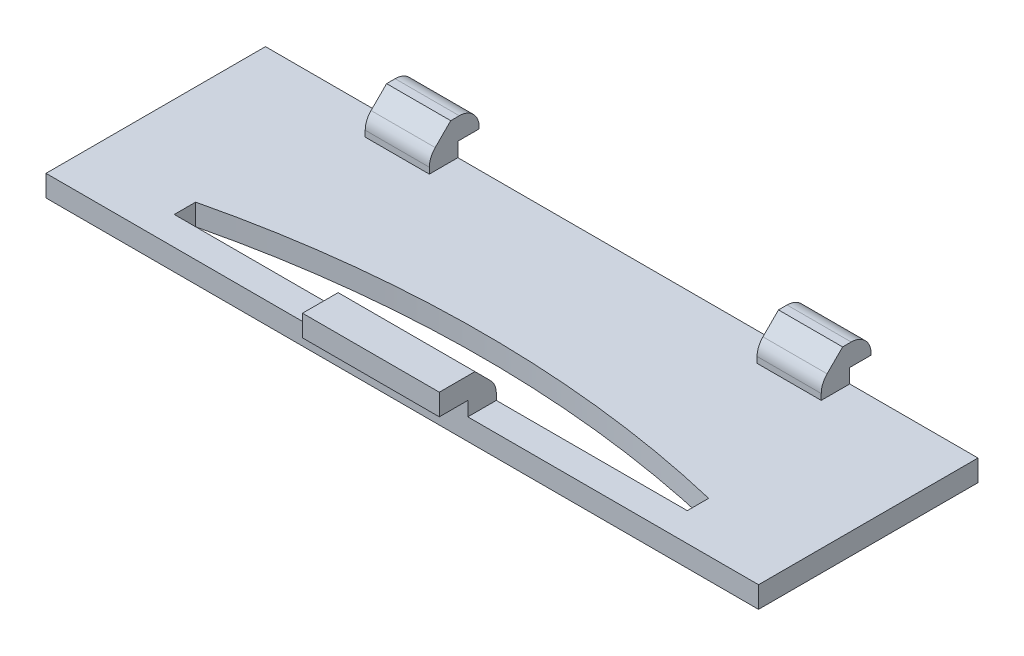
ISO-10303-21;
HEADER;
FILE_DESCRIPTION(('STEP AP214'),'2;1');
FILE_NAME('part.step','',(''),(''),'','','');
FILE_SCHEMA(('AUTOMOTIVE_DESIGN { 1 0 10303 214 1 1 1 1 }'));
ENDSEC;
DATA;
#1=APPLICATION_CONTEXT('core data for automotive mechanical design processes');
#2=APPLICATION_PROTOCOL_DEFINITION('international standard','automotive_design',2000,#1);
#3=PRODUCT_CONTEXT('',#1,'mechanical');
#4=PRODUCT('Part','Part','',(#3));
#5=PRODUCT_RELATED_PRODUCT_CATEGORY('part','',(#4));
#6=PRODUCT_DEFINITION_FORMATION('','',#4);
#7=PRODUCT_DEFINITION_CONTEXT('part definition',#1,'design');
#8=PRODUCT_DEFINITION('design','',#6,#7);
#9=PRODUCT_DEFINITION_SHAPE('','',#8);
#10=(LENGTH_UNIT() NAMED_UNIT(*) SI_UNIT(.MILLI.,.METRE.));
#11=(NAMED_UNIT(*) PLANE_ANGLE_UNIT() SI_UNIT($,.RADIAN.));
#12=(NAMED_UNIT(*) SI_UNIT($,.STERADIAN.) SOLID_ANGLE_UNIT());
#13=UNCERTAINTY_MEASURE_WITH_UNIT(LENGTH_MEASURE(1.E-05),#10,'distance_accuracy_value','');
#14=(GEOMETRIC_REPRESENTATION_CONTEXT(3) GLOBAL_UNCERTAINTY_ASSIGNED_CONTEXT((#13)) GLOBAL_UNIT_ASSIGNED_CONTEXT((#10,
#11,#12)) REPRESENTATION_CONTEXT('',''));
#15=CARTESIAN_POINT('',(0.,0.,0.));
#16=DIRECTION('',(0.,0.,1.));
#17=DIRECTION('',(1.,0.,0.));
#18=AXIS2_PLACEMENT_3D('',#15,#16,#17);
#19=CARTESIAN_POINT('',(0.,1.5,0.));
#20=DIRECTION('',(0.,1.,0.));
#21=DIRECTION('',(0.,0.,1.));
#22=AXIS2_PLACEMENT_3D('',#19,#20,#21);
#23=PLANE('',#22);
#24=DIRECTION('',(0.,0.,1.));
#25=VECTOR('',#24,1.);
#26=CARTESIAN_POINT('',(-79.2873563218391,1.5,-0.844827586206872));
#27=LINE('',#26,#25);
#28=CARTESIAN_POINT('',(-79.2873563218391,1.5,-0.844827586206872));
#29=VERTEX_POINT('',#28);
#30=CARTESIAN_POINT('',(-79.2873563218391,1.5,0.655172413793106));
#31=VERTEX_POINT('',#30);
#32=EDGE_CURVE('E296',#29,#31,#27,.T.);
#33=ORIENTED_EDGE('',*,*,#32,.F.);
#34=CARTESIAN_POINT('',(-61.287356321839,1.5,74.3895139735997));
#35=DIRECTION('',(0.,1.,0.));
#36=DIRECTION('',(0.,0.,1.));
#37=AXIS2_PLACEMENT_3D('',#34,#35,#36);
#38=CIRCLE('',#37,77.3576508817172);
#39=CARTESIAN_POINT('',(-43.2873563218391,1.5,-0.844827586206894));
#40=VERTEX_POINT('',#39);
#41=EDGE_CURVE('E267',#29,#40,#38,.F.);
#42=ORIENTED_EDGE('',*,*,#41,.T.);
#43=DIRECTION('',(0.,0.,-1.));
#44=VECTOR('',#43,1.);
#45=CARTESIAN_POINT('',(-43.2873563218391,1.5,-0.844827586206894));
#46=LINE('',#45,#44);
#47=CARTESIAN_POINT('',(-43.2873563218391,1.5,0.655172413793106));
#48=VERTEX_POINT('',#47);
#49=EDGE_CURVE('E272',#48,#40,#46,.T.);
#50=ORIENTED_EDGE('',*,*,#49,.F.);
#51=DIRECTION('',(1.,0.,0.));
#52=VECTOR('',#51,1.);
#53=CARTESIAN_POINT('',(-79.2873563218391,1.5,0.655172413793106));
#54=LINE('',#53,#52);
#55=CARTESIAN_POINT('',(-56.6873563218391,1.5,0.655172413793106));
#56=VERTEX_POINT('',#55);
#57=EDGE_CURVE('E509',#56,#48,#54,.T.);
#58=ORIENTED_EDGE('',*,*,#57,.F.);
#59=DIRECTION('',(0.,0.,-1.));
#60=VECTOR('',#59,1.);
#61=CARTESIAN_POINT('',(-56.6873563218391,1.5,0.655172413793106));
#62=LINE('',#61,#60);
#63=CARTESIAN_POINT('',(-56.6873563218391,1.5,2.65517241379311));
#64=VERTEX_POINT('',#63);
#65=EDGE_CURVE('E497',#64,#56,#62,.T.);
#66=ORIENTED_EDGE('',*,*,#65,.F.);
#67=DIRECTION('',(1.,0.,0.));
#68=VECTOR('',#67,1.);
#69=CARTESIAN_POINT('',(-36.2873563218391,1.5,2.6551724137931));
#70=LINE('',#69,#68);
#71=CARTESIAN_POINT('',(-36.2873563218391,1.5,2.6551724137931));
#72=VERTEX_POINT('',#71);
#73=EDGE_CURVE('E314',#64,#72,#70,.T.);
#74=ORIENTED_EDGE('',*,*,#73,.T.);
#75=DIRECTION('',(0.,0.,-1.));
#76=VECTOR('',#75,1.);
#77=CARTESIAN_POINT('',(-36.2873563218391,1.5,2.6551724137931));
#78=LINE('',#77,#76);
#79=CARTESIAN_POINT('',(-36.2873563218391,1.5,-12.7448275862069));
#80=VERTEX_POINT('',#79);
#81=EDGE_CURVE('E303',#72,#80,#78,.T.);
#82=ORIENTED_EDGE('',*,*,#81,.T.);
#83=DIRECTION('',(-1.,0.,0.));
#84=VECTOR('',#83,1.);
#85=CARTESIAN_POINT('',(-36.2873563218391,1.5,-12.7448275862069));
#86=LINE('',#85,#84);
#87=CARTESIAN_POINT('',(-45.2873563218391,1.5,-12.7448275862069));
#88=VERTEX_POINT('',#87);
#89=EDGE_CURVE('E308',#80,#88,#86,.T.);
#90=ORIENTED_EDGE('',*,*,#89,.T.);
#91=DIRECTION('',(0.,0.,-1.));
#92=VECTOR('',#91,1.);
#93=CARTESIAN_POINT('',(-45.2873563218391,1.5,-12.7448275862069));
#94=LINE('',#93,#92);
#95=CARTESIAN_POINT('',(-45.2873563218391,1.5,-10.7448275862069));
#96=VERTEX_POINT('',#95);
#97=EDGE_CURVE('E454',#96,#88,#94,.T.);
#98=ORIENTED_EDGE('',*,*,#97,.F.);
#99=DIRECTION('',(1.,0.,0.));
#100=VECTOR('',#99,1.);
#101=CARTESIAN_POINT('',(-49.7873563218391,1.5,-10.7448275862069));
#102=LINE('',#101,#100);
#103=CARTESIAN_POINT('',(-49.7873563218391,1.5,-10.7448275862069));
#104=VERTEX_POINT('',#103);
#105=EDGE_CURVE('E459',#104,#96,#102,.T.);
#106=ORIENTED_EDGE('',*,*,#105,.F.);
#107=DIRECTION('',(0.,0.,1.));
#108=VECTOR('',#107,1.);
#109=CARTESIAN_POINT('',(-49.7873563218391,1.5,-12.7448275862069));
#110=LINE('',#109,#108);
#111=CARTESIAN_POINT('',(-49.7873563218391,1.5,-12.7448275862069));
#112=VERTEX_POINT('',#111);
#113=EDGE_CURVE('E450',#112,#104,#110,.T.);
#114=ORIENTED_EDGE('',*,*,#113,.F.);
#115=CARTESIAN_POINT('',(-72.7873563218391,1.5,-12.7448275862069));
#116=VERTEX_POINT('',#115);
#117=EDGE_CURVE('E312',#112,#116,#86,.T.);
#118=ORIENTED_EDGE('',*,*,#117,.T.);
#119=DIRECTION('',(0.,0.,-1.));
#120=VECTOR('',#119,1.);
#121=CARTESIAN_POINT('',(-72.7873563218391,1.5,-12.7448275862069));
#122=LINE('',#121,#120);
#123=CARTESIAN_POINT('',(-72.7873563218391,1.5,-10.7448275862069));
#124=VERTEX_POINT('',#123);
#125=EDGE_CURVE('E475',#124,#116,#122,.T.);
#126=ORIENTED_EDGE('',*,*,#125,.F.);
#127=DIRECTION('',(1.,0.,0.));
#128=VECTOR('',#127,1.);
#129=CARTESIAN_POINT('',(-77.2873563218391,1.5,-10.7448275862069));
#130=LINE('',#129,#128);
#131=CARTESIAN_POINT('',(-77.2873563218391,1.5,-10.7448275862069));
#132=VERTEX_POINT('',#131);
#133=EDGE_CURVE('E481',#132,#124,#130,.T.);
#134=ORIENTED_EDGE('',*,*,#133,.F.);
#135=DIRECTION('',(0.,0.,1.));
#136=VECTOR('',#135,1.);
#137=CARTESIAN_POINT('',(-77.2873563218391,1.5,-12.7448275862069));
#138=LINE('',#137,#136);
#139=CARTESIAN_POINT('',(-77.2873563218391,1.5,-12.7448275862069));
#140=VERTEX_POINT('',#139);
#141=EDGE_CURVE('E471',#140,#132,#138,.T.);
#142=ORIENTED_EDGE('',*,*,#141,.F.);
#143=CARTESIAN_POINT('',(-86.2873563218391,1.5,-12.7448275862069));
#144=VERTEX_POINT('',#143);
#145=EDGE_CURVE('E306',#140,#144,#86,.T.);
#146=ORIENTED_EDGE('',*,*,#145,.T.);
#147=DIRECTION('',(0.,0.,1.));
#148=VECTOR('',#147,1.);
#149=CARTESIAN_POINT('',(-86.2873563218391,1.5,2.65517241379311));
#150=LINE('',#149,#148);
#151=CARTESIAN_POINT('',(-86.2873563218391,1.5,2.65517241379311));
#152=VERTEX_POINT('',#151);
#153=EDGE_CURVE('E311',#144,#152,#150,.T.);
#154=ORIENTED_EDGE('',*,*,#153,.T.);
#155=CARTESIAN_POINT('',(-66.2873563218391,1.5,2.65517241379311));
#156=VERTEX_POINT('',#155);
#157=EDGE_CURVE('E315',#152,#156,#70,.T.);
#158=ORIENTED_EDGE('',*,*,#157,.T.);
#159=DIRECTION('',(0.,0.,1.));
#160=VECTOR('',#159,1.);
#161=CARTESIAN_POINT('',(-66.2873563218391,1.5,0.655172413793106));
#162=LINE('',#161,#160);
#163=CARTESIAN_POINT('',(-66.2873563218391,1.5,0.655172413793106));
#164=VERTEX_POINT('',#163);
#165=EDGE_CURVE('E493',#164,#156,#162,.T.);
#166=ORIENTED_EDGE('',*,*,#165,.F.);
#167=EDGE_CURVE('E510',#31,#164,#54,.T.);
#168=ORIENTED_EDGE('',*,*,#167,.F.);
#169=EDGE_LOOP('',(#33,#42,#50,#58,#66,#74,#82,#90,#98,#106,#114,#118,#126,#134,#142,#146,#154,
#158,#166,#168));
#170=FACE_BOUND('',#169,.T.);
#171=ADVANCED_FACE('F42',(#170),#23,.T.);
#172=CARTESIAN_POINT('',(0.,0.,0.));
#173=DIRECTION('',(0.,1.,0.));
#174=DIRECTION('',(0.,0.,1.));
#175=AXIS2_PLACEMENT_3D('',#172,#173,#174);
#176=PLANE('',#175);
#177=DIRECTION('',(0.,0.,-1.));
#178=VECTOR('',#177,1.);
#179=CARTESIAN_POINT('',(-36.2873563218391,0.,2.6551724137931));
#180=LINE('',#179,#178);
#181=CARTESIAN_POINT('',(-36.2873563218391,0.,2.6551724137931));
#182=VERTEX_POINT('',#181);
#183=CARTESIAN_POINT('',(-36.2873563218391,0.,-12.7448275862069));
#184=VERTEX_POINT('',#183);
#185=EDGE_CURVE('E302',#182,#184,#180,.T.);
#186=ORIENTED_EDGE('',*,*,#185,.F.);
#187=DIRECTION('',(1.,0.,0.));
#188=VECTOR('',#187,1.);
#189=CARTESIAN_POINT('',(-36.2873563218391,0.,2.6551724137931));
#190=LINE('',#189,#188);
#191=CARTESIAN_POINT('',(-86.2873563218391,0.,2.65517241379311));
#192=VERTEX_POINT('',#191);
#193=EDGE_CURVE('E307',#192,#182,#190,.T.);
#194=ORIENTED_EDGE('',*,*,#193,.F.);
#195=DIRECTION('',(0.,0.,1.));
#196=VECTOR('',#195,1.);
#197=CARTESIAN_POINT('',(-86.2873563218391,0.,2.65517241379311));
#198=LINE('',#197,#196);
#199=CARTESIAN_POINT('',(-86.2873563218391,0.,-12.7448275862069));
#200=VERTEX_POINT('',#199);
#201=EDGE_CURVE('E323',#200,#192,#198,.T.);
#202=ORIENTED_EDGE('',*,*,#201,.F.);
#203=DIRECTION('',(-1.,0.,0.));
#204=VECTOR('',#203,1.);
#205=CARTESIAN_POINT('',(-36.2873563218391,0.,-12.7448275862069));
#206=LINE('',#205,#204);
#207=EDGE_CURVE('E321',#184,#200,#206,.T.);
#208=ORIENTED_EDGE('',*,*,#207,.F.);
#209=EDGE_LOOP('',(#186,#194,#202,#208));
#210=FACE_BOUND('',#209,.T.);
#211=CARTESIAN_POINT('',(-61.287356321839,0.,74.3895139735997));
#212=DIRECTION('',(0.,1.,0.));
#213=DIRECTION('',(0.,0.,-1.));
#214=AXIS2_PLACEMENT_3D('',#211,#212,#213);
#215=CIRCLE('',#214,77.3576508817172);
#216=CARTESIAN_POINT('',(-43.2873563218391,0.,-0.844827586206894));
#217=VERTEX_POINT('',#216);
#218=CARTESIAN_POINT('',(-79.2873563218391,0.,-0.844827586206872));
#219=VERTEX_POINT('',#218);
#220=EDGE_CURVE('E264',#217,#219,#215,.T.);
#221=ORIENTED_EDGE('',*,*,#220,.T.);
#222=DIRECTION('',(0.,0.,1.));
#223=VECTOR('',#222,1.);
#224=CARTESIAN_POINT('',(-79.2873563218391,0.,-0.844827586206872));
#225=LINE('',#224,#223);
#226=CARTESIAN_POINT('',(-79.2873563218391,0.,0.655172413793106));
#227=VERTEX_POINT('',#226);
#228=EDGE_CURVE('E279',#219,#227,#225,.T.);
#229=ORIENTED_EDGE('',*,*,#228,.T.);
#230=DIRECTION('',(1.,0.,0.));
#231=VECTOR('',#230,1.);
#232=CARTESIAN_POINT('',(-79.2873563218391,0.,0.655172413793106));
#233=LINE('',#232,#231);
#234=CARTESIAN_POINT('',(-43.2873563218391,0.,0.655172413793106));
#235=VERTEX_POINT('',#234);
#236=EDGE_CURVE('E287',#227,#235,#233,.T.);
#237=ORIENTED_EDGE('',*,*,#236,.T.);
#238=DIRECTION('',(0.,0.,-1.));
#239=VECTOR('',#238,1.);
#240=CARTESIAN_POINT('',(-43.2873563218391,0.,-0.844827586206894));
#241=LINE('',#240,#239);
#242=EDGE_CURVE('E281',#235,#217,#241,.T.);
#243=ORIENTED_EDGE('',*,*,#242,.T.);
#244=EDGE_LOOP('',(#221,#229,#237,#243));
#245=FACE_BOUND('',#244,.T.);
#246=ADVANCED_FACE('F277',(#210,#245),#176,.F.);
#247=CARTESIAN_POINT('',(-36.2873563218391,1.5,-12.7448275862069));
#248=DIRECTION('',(0.,0.,1.));
#249=DIRECTION('',(1.,0.,0.));
#250=AXIS2_PLACEMENT_3D('',#247,#248,#249);
#251=PLANE('',#250);
#252=DIRECTION('',(-1.,0.,0.));
#253=VECTOR('',#252,1.);
#254=CARTESIAN_POINT('',(-72.7873563218391,2.5,-12.7448275862069));
#255=LINE('',#254,#253);
#256=CARTESIAN_POINT('',(-72.7873563218391,2.5,-12.7448275862069));
#257=VERTEX_POINT('',#256);
#258=CARTESIAN_POINT('',(-77.2873563218391,2.5,-12.7448275862069));
#259=VERTEX_POINT('',#258);
#260=EDGE_CURVE('E525',#257,#259,#255,.T.);
#261=ORIENTED_EDGE('',*,*,#260,.F.);
#262=DIRECTION('',(0.,-1.,0.));
#263=VECTOR('',#262,1.);
#264=CARTESIAN_POINT('',(-72.7873563218391,4.,-12.7448275862069));
#265=LINE('',#264,#263);
#266=EDGE_CURVE('E487',#257,#116,#265,.T.);
#267=ORIENTED_EDGE('',*,*,#266,.T.);
#268=ORIENTED_EDGE('',*,*,#117,.F.);
#269=DIRECTION('',(0.,-1.,0.));
#270=VECTOR('',#269,1.);
#271=CARTESIAN_POINT('',(-49.7873563218391,4.,-12.7448275862069));
#272=LINE('',#271,#270);
#273=CARTESIAN_POINT('',(-49.7873563218391,2.5,-12.7448275862069));
#274=VERTEX_POINT('',#273);
#275=EDGE_CURVE('E456',#274,#112,#272,.T.);
#276=ORIENTED_EDGE('',*,*,#275,.F.);
#277=DIRECTION('',(-1.,0.,0.));
#278=VECTOR('',#277,1.);
#279=CARTESIAN_POINT('',(-45.2873563218391,2.5,-12.7448275862069));
#280=LINE('',#279,#278);
#281=CARTESIAN_POINT('',(-45.2873563218391,2.5,-12.7448275862069));
#282=VERTEX_POINT('',#281);
#283=EDGE_CURVE('E418',#282,#274,#280,.T.);
#284=ORIENTED_EDGE('',*,*,#283,.F.);
#285=DIRECTION('',(0.,-1.,0.));
#286=VECTOR('',#285,1.);
#287=CARTESIAN_POINT('',(-45.2873563218391,4.,-12.7448275862069));
#288=LINE('',#287,#286);
#289=EDGE_CURVE('E465',#282,#88,#288,.T.);
#290=ORIENTED_EDGE('',*,*,#289,.T.);
#291=ORIENTED_EDGE('',*,*,#89,.F.);
#292=DIRECTION('',(0.,-1.,0.));
#293=VECTOR('',#292,1.);
#294=CARTESIAN_POINT('',(-36.2873563218391,1.5,-12.7448275862069));
#295=LINE('',#294,#293);
#296=EDGE_CURVE('E334',#80,#184,#295,.T.);
#297=ORIENTED_EDGE('',*,*,#296,.T.);
#298=ORIENTED_EDGE('',*,*,#207,.T.);
#299=DIRECTION('',(0.,-1.,0.));
#300=VECTOR('',#299,1.);
#301=CARTESIAN_POINT('',(-86.2873563218391,1.5,-12.7448275862069));
#302=LINE('',#301,#300);
#303=EDGE_CURVE('E331',#144,#200,#302,.T.);
#304=ORIENTED_EDGE('',*,*,#303,.F.);
#305=ORIENTED_EDGE('',*,*,#145,.F.);
#306=DIRECTION('',(0.,-1.,0.));
#307=VECTOR('',#306,1.);
#308=CARTESIAN_POINT('',(-77.2873563218391,4.,-12.7448275862069));
#309=LINE('',#308,#307);
#310=EDGE_CURVE('E478',#259,#140,#309,.T.);
#311=ORIENTED_EDGE('',*,*,#310,.F.);
#312=EDGE_LOOP('',(#261,#267,#268,#276,#284,#290,#291,#297,#298,#304,#305,#311));
#313=FACE_BOUND('',#312,.T.);
#314=ADVANCED_FACE('F550',(#313),#251,.F.);
#315=CARTESIAN_POINT('',(-36.2873563218391,1.5,2.6551724137931));
#316=DIRECTION('',(-1.,0.,0.));
#317=DIRECTION('',(0.,0.,1.));
#318=AXIS2_PLACEMENT_3D('',#315,#316,#317);
#319=PLANE('',#318);
#320=ORIENTED_EDGE('',*,*,#185,.T.);
#321=ORIENTED_EDGE('',*,*,#296,.F.);
#322=ORIENTED_EDGE('',*,*,#81,.F.);
#323=DIRECTION('',(0.,-1.,0.));
#324=VECTOR('',#323,1.);
#325=CARTESIAN_POINT('',(-36.2873563218391,1.5,2.6551724137931));
#326=LINE('',#325,#324);
#327=EDGE_CURVE('E318',#72,#182,#326,.T.);
#328=ORIENTED_EDGE('',*,*,#327,.T.);
#329=EDGE_LOOP('',(#320,#321,#322,#328));
#330=FACE_BOUND('',#329,.T.);
#331=ADVANCED_FACE('F612',(#330),#319,.F.);
#332=CARTESIAN_POINT('',(-86.2873563218391,1.5,2.65517241379311));
#333=DIRECTION('',(1.,0.,0.));
#334=DIRECTION('',(0.,0.,-1.));
#335=AXIS2_PLACEMENT_3D('',#332,#333,#334);
#336=PLANE('',#335);
#337=ORIENTED_EDGE('',*,*,#201,.T.);
#338=DIRECTION('',(0.,-1.,0.));
#339=VECTOR('',#338,1.);
#340=CARTESIAN_POINT('',(-86.2873563218391,1.5,2.65517241379311));
#341=LINE('',#340,#339);
#342=EDGE_CURVE('E328',#152,#192,#341,.T.);
#343=ORIENTED_EDGE('',*,*,#342,.F.);
#344=ORIENTED_EDGE('',*,*,#153,.F.);
#345=ORIENTED_EDGE('',*,*,#303,.T.);
#346=EDGE_LOOP('',(#337,#343,#344,#345));
#347=FACE_BOUND('',#346,.T.);
#348=ADVANCED_FACE('F572',(#347),#336,.F.);
#349=CARTESIAN_POINT('',(-36.2873563218391,1.5,2.6551724137931));
#350=DIRECTION('',(0.,0.,-1.));
#351=DIRECTION('',(-1.,0.,0.));
#352=AXIS2_PLACEMENT_3D('',#349,#350,#351);
#353=PLANE('',#352);
#354=DIRECTION('',(0.,-1.,0.));
#355=VECTOR('',#354,1.);
#356=CARTESIAN_POINT('',(-56.6873563218391,4.,2.65517241379311));
#357=LINE('',#356,#355);
#358=CARTESIAN_POINT('',(-56.6873563218391,2.5,2.6551724137931));
#359=VERTEX_POINT('',#358);
#360=EDGE_CURVE('E291',#359,#64,#357,.T.);
#361=ORIENTED_EDGE('',*,*,#360,.F.);
#362=DIRECTION('',(-1.,0.,0.));
#363=VECTOR('',#362,1.);
#364=CARTESIAN_POINT('',(0.,2.50000000000001,2.6551724137931));
#365=LINE('',#364,#363);
#366=CARTESIAN_POINT('',(-66.2873563218391,2.5,2.65517241379311));
#367=VERTEX_POINT('',#366);
#368=EDGE_CURVE('E432',#359,#367,#365,.T.);
#369=ORIENTED_EDGE('',*,*,#368,.T.);
#370=DIRECTION('',(0.,-1.,0.));
#371=VECTOR('',#370,1.);
#372=CARTESIAN_POINT('',(-66.2873563218391,4.,2.65517241379311));
#373=LINE('',#372,#371);
#374=EDGE_CURVE('E288',#367,#156,#373,.T.);
#375=ORIENTED_EDGE('',*,*,#374,.T.);
#376=ORIENTED_EDGE('',*,*,#157,.F.);
#377=ORIENTED_EDGE('',*,*,#342,.T.);
#378=ORIENTED_EDGE('',*,*,#193,.T.);
#379=ORIENTED_EDGE('',*,*,#327,.F.);
#380=ORIENTED_EDGE('',*,*,#73,.F.);
#381=EDGE_LOOP('',(#361,#369,#375,#376,#377,#378,#379,#380));
#382=FACE_BOUND('',#381,.T.);
#383=ADVANCED_FACE('F577',(#382),#353,.F.);
#384=CARTESIAN_POINT('',(-79.2873563218391,1.5,-0.844827586206872));
#385=DIRECTION('',(1.,0.,0.));
#386=DIRECTION('',(0.,0.,-1.));
#387=AXIS2_PLACEMENT_3D('',#384,#385,#386);
#388=PLANE('',#387);
#389=ORIENTED_EDGE('',*,*,#228,.F.);
#390=DIRECTION('',(0.,-1.,0.));
#391=VECTOR('',#390,1.);
#392=CARTESIAN_POINT('',(-79.2873563218391,1.5,-0.844827586206872));
#393=LINE('',#392,#391);
#394=EDGE_CURVE('E261',#29,#219,#393,.T.);
#395=ORIENTED_EDGE('',*,*,#394,.F.);
#396=ORIENTED_EDGE('',*,*,#32,.T.);
#397=DIRECTION('',(0.,-1.,0.));
#398=VECTOR('',#397,1.);
#399=CARTESIAN_POINT('',(-79.2873563218391,1.5,0.655172413793106));
#400=LINE('',#399,#398);
#401=EDGE_CURVE('E286',#31,#227,#400,.T.);
#402=ORIENTED_EDGE('',*,*,#401,.T.);
#403=EDGE_LOOP('',(#389,#395,#396,#402));
#404=FACE_BOUND('',#403,.T.);
#405=ADVANCED_FACE('F284',(#404),#388,.T.);
#406=CARTESIAN_POINT('',(-79.2873563218391,1.5,0.655172413793106));
#407=DIRECTION('',(0.,0.,-1.));
#408=DIRECTION('',(-1.,0.,0.));
#409=AXIS2_PLACEMENT_3D('',#406,#407,#408);
#410=PLANE('',#409);
#411=DIRECTION('',(0.,-1.,0.));
#412=VECTOR('',#411,1.);
#413=CARTESIAN_POINT('',(-66.2873563218391,4.,0.655172413793106));
#414=LINE('',#413,#412);
#415=CARTESIAN_POINT('',(-66.2873563218391,1.92010101267766,0.655172413793106));
#416=VERTEX_POINT('',#415);
#417=EDGE_CURVE('E500',#416,#164,#414,.T.);
#418=ORIENTED_EDGE('',*,*,#417,.F.);
#419=DIRECTION('',(-1.,0.,0.));
#420=VECTOR('',#419,1.);
#421=CARTESIAN_POINT('',(-79.2873563218391,1.92010101267766,0.655172413793106));
#422=LINE('',#421,#420);
#423=CARTESIAN_POINT('',(-56.6873563218391,1.92010101267766,0.655172413793106));
#424=VERTEX_POINT('',#423);
#425=EDGE_CURVE('E381',#416,#424,#422,.F.);
#426=ORIENTED_EDGE('',*,*,#425,.T.);
#427=DIRECTION('',(0.,-1.,0.));
#428=VECTOR('',#427,1.);
#429=CARTESIAN_POINT('',(-56.6873563218391,4.,0.655172413793106));
#430=LINE('',#429,#428);
#431=EDGE_CURVE('E506',#424,#56,#430,.T.);
#432=ORIENTED_EDGE('',*,*,#431,.T.);
#433=ORIENTED_EDGE('',*,*,#57,.T.);
#434=DIRECTION('',(0.,-1.,0.));
#435=VECTOR('',#434,1.);
#436=CARTESIAN_POINT('',(-43.2873563218391,1.5,0.655172413793106));
#437=LINE('',#436,#435);
#438=EDGE_CURVE('E299',#48,#235,#437,.T.);
#439=ORIENTED_EDGE('',*,*,#438,.T.);
#440=ORIENTED_EDGE('',*,*,#236,.F.);
#441=ORIENTED_EDGE('',*,*,#401,.F.);
#442=ORIENTED_EDGE('',*,*,#167,.T.);
#443=EDGE_LOOP('',(#418,#426,#432,#433,#439,#440,#441,#442));
#444=FACE_BOUND('',#443,.T.);
#445=ADVANCED_FACE('F518',(#444),#410,.T.);
#446=CARTESIAN_POINT('',(-43.2873563218391,1.5,-0.844827586206894));
#447=DIRECTION('',(-1.,0.,0.));
#448=DIRECTION('',(0.,0.,1.));
#449=AXIS2_PLACEMENT_3D('',#446,#447,#448);
#450=PLANE('',#449);
#451=ORIENTED_EDGE('',*,*,#242,.F.);
#452=ORIENTED_EDGE('',*,*,#438,.F.);
#453=ORIENTED_EDGE('',*,*,#49,.T.);
#454=DIRECTION('',(0.,-1.,0.));
#455=VECTOR('',#454,1.);
#456=CARTESIAN_POINT('',(-43.2873563218391,1.5,-0.844827586206894));
#457=LINE('',#456,#455);
#458=EDGE_CURVE('E271',#40,#217,#457,.T.);
#459=ORIENTED_EDGE('',*,*,#458,.T.);
#460=EDGE_LOOP('',(#451,#452,#453,#459));
#461=FACE_BOUND('',#460,.T.);
#462=ADVANCED_FACE('F524',(#461),#450,.T.);
#463=CARTESIAN_POINT('',(-66.2873563218391,4.,0.655172413793106));
#464=DIRECTION('',(1.,0.,0.));
#465=DIRECTION('',(0.,0.,-1.));
#466=AXIS2_PLACEMENT_3D('',#463,#464,#465);
#467=PLANE('',#466);
#468=DIRECTION('',(0.,0.707106781186549,0.707106781186546));
#469=VECTOR('',#468,1.);
#470=CARTESIAN_POINT('',(-66.2873563218391,4.,2.15517241379311));
#471=LINE('',#470,#469);
#472=CARTESIAN_POINT('',(-66.2873563218391,4.,2.15517241379311));
#473=VERTEX_POINT('',#472);
#474=CARTESIAN_POINT('',(-66.2873563218391,2.91005050633883,1.06522292013194));
#475=VERTEX_POINT('',#474);
#476=EDGE_CURVE('E349',#473,#475,#471,.F.);
#477=ORIENTED_EDGE('',*,*,#476,.T.);
#478=CARTESIAN_POINT('',(-66.2873563218391,1.92010101267766,2.05517241379311));
#479=DIRECTION('',(1.,0.,0.));
#480=DIRECTION('',(0.,0.,-1.));
#481=AXIS2_PLACEMENT_3D('',#478,#479,#480);
#482=CIRCLE('',#481,1.4);
#483=EDGE_CURVE('E388',#475,#416,#482,.F.);
#484=ORIENTED_EDGE('',*,*,#483,.T.);
#485=ORIENTED_EDGE('',*,*,#417,.T.);
#486=ORIENTED_EDGE('',*,*,#165,.T.);
#487=ORIENTED_EDGE('',*,*,#374,.F.);
#488=DIRECTION('',(0.,0.,-1.));
#489=VECTOR('',#488,1.);
#490=CARTESIAN_POINT('',(-66.2873563218391,2.5,4.6551724137931));
#491=LINE('',#490,#489);
#492=CARTESIAN_POINT('',(-66.2873563218391,2.5,4.6551724137931));
#493=VERTEX_POINT('',#492);
#494=EDGE_CURVE('E444',#493,#367,#491,.T.);
#495=ORIENTED_EDGE('',*,*,#494,.F.);
#496=DIRECTION('',(0.,-1.,0.));
#497=VECTOR('',#496,1.);
#498=CARTESIAN_POINT('',(-66.2873563218391,0.,4.6551724137931));
#499=LINE('',#498,#497);
#500=CARTESIAN_POINT('',(-66.2873563218391,4.,4.6551724137931));
#501=VERTEX_POINT('',#500);
#502=EDGE_CURVE('E442',#501,#493,#499,.T.);
#503=ORIENTED_EDGE('',*,*,#502,.F.);
#504=DIRECTION('',(0.,0.,1.));
#505=VECTOR('',#504,1.);
#506=CARTESIAN_POINT('',(-66.2873563218391,4.,0.655172413793106));
#507=LINE('',#506,#505);
#508=EDGE_CURVE('E494',#473,#501,#507,.T.);
#509=ORIENTED_EDGE('',*,*,#508,.F.);
#510=EDGE_LOOP('',(#477,#484,#485,#486,#487,#495,#503,#509));
#511=FACE_BOUND('',#510,.T.);
#512=ADVANCED_FACE('F581',(#511),#467,.F.);
#513=CARTESIAN_POINT('',(-56.6873563218391,4.,0.655172413793106));
#514=DIRECTION('',(-1.,0.,0.));
#515=DIRECTION('',(0.,0.,1.));
#516=AXIS2_PLACEMENT_3D('',#513,#514,#515);
#517=PLANE('',#516);
#518=ORIENTED_EDGE('',*,*,#431,.F.);
#519=CARTESIAN_POINT('',(-56.6873563218391,1.92010101267766,2.05517241379311));
#520=DIRECTION('',(-1.,0.,0.));
#521=DIRECTION('',(0.,0.,1.));
#522=AXIS2_PLACEMENT_3D('',#519,#520,#521);
#523=CIRCLE('',#522,1.4);
#524=CARTESIAN_POINT('',(-56.6873563218391,2.91005050633883,1.06522292013194));
#525=VERTEX_POINT('',#524);
#526=EDGE_CURVE('E384',#424,#525,#523,.F.);
#527=ORIENTED_EDGE('',*,*,#526,.T.);
#528=DIRECTION('',(0.,-0.707106781186549,-0.707106781186546));
#529=VECTOR('',#528,1.);
#530=CARTESIAN_POINT('',(-56.6873563218391,4.,2.15517241379311));
#531=LINE('',#530,#529);
#532=CARTESIAN_POINT('',(-56.6873563218391,4.,2.15517241379311));
#533=VERTEX_POINT('',#532);
#534=EDGE_CURVE('E352',#525,#533,#531,.F.);
#535=ORIENTED_EDGE('',*,*,#534,.T.);
#536=DIRECTION('',(0.,0.,-1.));
#537=VECTOR('',#536,1.);
#538=CARTESIAN_POINT('',(-56.6873563218391,4.,0.655172413793106));
#539=LINE('',#538,#537);
#540=CARTESIAN_POINT('',(-56.6873563218391,4.,4.6551724137931));
#541=VERTEX_POINT('',#540);
#542=EDGE_CURVE('E496',#541,#533,#539,.T.);
#543=ORIENTED_EDGE('',*,*,#542,.F.);
#544=DIRECTION('',(0.,1.,0.));
#545=VECTOR('',#544,1.);
#546=CARTESIAN_POINT('',(-56.6873563218391,0.,4.6551724137931));
#547=LINE('',#546,#545);
#548=CARTESIAN_POINT('',(-56.6873563218391,2.5,4.6551724137931));
#549=VERTEX_POINT('',#548);
#550=EDGE_CURVE('E436',#549,#541,#547,.T.);
#551=ORIENTED_EDGE('',*,*,#550,.F.);
#552=DIRECTION('',(0.,0.,-1.));
#553=VECTOR('',#552,1.);
#554=CARTESIAN_POINT('',(-56.6873563218391,2.5,4.6551724137931));
#555=LINE('',#554,#553);
#556=EDGE_CURVE('E448',#549,#359,#555,.T.);
#557=ORIENTED_EDGE('',*,*,#556,.T.);
#558=ORIENTED_EDGE('',*,*,#360,.T.);
#559=ORIENTED_EDGE('',*,*,#65,.T.);
#560=EDGE_LOOP('',(#518,#527,#535,#543,#551,#557,#558,#559));
#561=FACE_BOUND('',#560,.T.);
#562=ADVANCED_FACE('F590',(#561),#517,.F.);
#563=CARTESIAN_POINT('',(0.,4.,0.));
#564=DIRECTION('',(0.,1.,0.));
#565=DIRECTION('',(0.,0.,1.));
#566=AXIS2_PLACEMENT_3D('',#563,#564,#565);
#567=PLANE('',#566);
#568=ORIENTED_EDGE('',*,*,#542,.T.);
#569=DIRECTION('',(-1.,0.,0.));
#570=VECTOR('',#569,1.);
#571=CARTESIAN_POINT('',(0.,4.,2.15517241379311));
#572=LINE('',#571,#570);
#573=EDGE_CURVE('E346',#533,#473,#572,.T.);
#574=ORIENTED_EDGE('',*,*,#573,.T.);
#575=ORIENTED_EDGE('',*,*,#508,.T.);
#576=DIRECTION('',(-1.,0.,0.));
#577=VECTOR('',#576,1.);
#578=CARTESIAN_POINT('',(0.,4.,4.6551724137931));
#579=LINE('',#578,#577);
#580=EDGE_CURVE('E439',#541,#501,#579,.T.);
#581=ORIENTED_EDGE('',*,*,#580,.F.);
#582=EDGE_LOOP('',(#568,#574,#575,#581));
#583=FACE_BOUND('',#582,.T.);
#584=ADVANCED_FACE('F596',(#583),#567,.T.);
#585=CARTESIAN_POINT('',(-77.2873563218391,4.,-12.7448275862069));
#586=DIRECTION('',(1.,0.,0.));
#587=DIRECTION('',(0.,0.,-1.));
#588=AXIS2_PLACEMENT_3D('',#585,#586,#587);
#589=PLANE('',#588);
#590=DIRECTION('',(0.,0.,1.));
#591=VECTOR('',#590,1.);
#592=CARTESIAN_POINT('',(-77.2873563218391,4.,-12.7448275862069));
#593=LINE('',#592,#591);
#594=CARTESIAN_POINT('',(-77.2873563218391,4.,-12.8448275862069));
#595=VERTEX_POINT('',#594);
#596=CARTESIAN_POINT('',(-77.2873563218391,4.,-12.2448275862069));
#597=VERTEX_POINT('',#596);
#598=EDGE_CURVE('E472',#595,#597,#593,.T.);
#599=ORIENTED_EDGE('',*,*,#598,.F.);
#600=CARTESIAN_POINT('',(-77.2873563218391,2.6,-12.8448275862069));
#601=DIRECTION('',(1.,0.,0.));
#602=DIRECTION('',(0.,0.,-1.));
#603=AXIS2_PLACEMENT_3D('',#600,#601,#602);
#604=CIRCLE('',#603,1.4);
#605=CARTESIAN_POINT('',(-77.2873563218391,2.6,-14.2448275862069));
#606=VERTEX_POINT('',#605);
#607=EDGE_CURVE('E397',#595,#606,#604,.F.);
#608=ORIENTED_EDGE('',*,*,#607,.T.);
#609=DIRECTION('',(0.,1.,0.));
#610=VECTOR('',#609,1.);
#611=CARTESIAN_POINT('',(-77.2873563218391,4.,-14.2448275862069));
#612=LINE('',#611,#610);
#613=CARTESIAN_POINT('',(-77.2873563218391,2.5,-14.2448275862069));
#614=VERTEX_POINT('',#613);
#615=EDGE_CURVE('E533',#614,#606,#612,.T.);
#616=ORIENTED_EDGE('',*,*,#615,.F.);
#617=DIRECTION('',(0.,0.,1.));
#618=VECTOR('',#617,1.);
#619=CARTESIAN_POINT('',(-77.2873563218391,2.5,-14.2448275862069));
#620=LINE('',#619,#618);
#621=EDGE_CURVE('E535',#614,#259,#620,.T.);
#622=ORIENTED_EDGE('',*,*,#621,.T.);
#623=ORIENTED_EDGE('',*,*,#310,.T.);
#624=ORIENTED_EDGE('',*,*,#141,.T.);
#625=DIRECTION('',(0.,-1.,0.));
#626=VECTOR('',#625,1.);
#627=CARTESIAN_POINT('',(-77.2873563218391,4.,-10.7448275862069));
#628=LINE('',#627,#626);
#629=CARTESIAN_POINT('',(-77.2873563218391,1.92010101267766,-10.7448275862069));
#630=VERTEX_POINT('',#629);
#631=EDGE_CURVE('E491',#630,#132,#628,.T.);
#632=ORIENTED_EDGE('',*,*,#631,.F.);
#633=CARTESIAN_POINT('',(-77.2873563218391,1.92010101267766,-12.1448275862069));
#634=DIRECTION('',(1.,0.,0.));
#635=DIRECTION('',(0.,0.,-1.));
#636=AXIS2_PLACEMENT_3D('',#633,#634,#635);
#637=CIRCLE('',#636,1.4);
#638=CARTESIAN_POINT('',(-77.2873563218391,2.91005050633882,-11.1548780925457));
#639=VERTEX_POINT('',#638);
#640=EDGE_CURVE('E375',#630,#639,#637,.F.);
#641=ORIENTED_EDGE('',*,*,#640,.T.);
#642=DIRECTION('',(0.,0.707106781186549,-0.707106781186546));
#643=VECTOR('',#642,1.);
#644=CARTESIAN_POINT('',(-77.2873563218391,4.,-12.2448275862069));
#645=LINE('',#644,#643);
#646=EDGE_CURVE('E343',#639,#597,#645,.T.);
#647=ORIENTED_EDGE('',*,*,#646,.T.);
#648=EDGE_LOOP('',(#599,#608,#616,#622,#623,#624,#632,#641,#647));
#649=FACE_BOUND('',#648,.T.);
#650=ADVANCED_FACE('F565',(#649),#589,.F.);
#651=CARTESIAN_POINT('',(-77.2873563218391,4.,-10.7448275862069));
#652=DIRECTION('',(0.,0.,-1.));
#653=DIRECTION('',(-1.,0.,0.));
#654=AXIS2_PLACEMENT_3D('',#651,#652,#653);
#655=PLANE('',#654);
#656=DIRECTION('',(0.,-1.,0.));
#657=VECTOR('',#656,1.);
#658=CARTESIAN_POINT('',(-72.7873563218391,4.,-10.7448275862069));
#659=LINE('',#658,#657);
#660=CARTESIAN_POINT('',(-72.7873563218391,1.92010101267766,-10.7448275862069));
#661=VERTEX_POINT('',#660);
#662=EDGE_CURVE('E489',#661,#124,#659,.T.);
#663=ORIENTED_EDGE('',*,*,#662,.F.);
#664=DIRECTION('',(-1.,0.,0.));
#665=VECTOR('',#664,1.);
#666=CARTESIAN_POINT('',(-77.2873563218391,1.92010101267766,-10.7448275862069));
#667=LINE('',#666,#665);
#668=EDGE_CURVE('E372',#661,#630,#667,.T.);
#669=ORIENTED_EDGE('',*,*,#668,.T.);
#670=ORIENTED_EDGE('',*,*,#631,.T.);
#671=ORIENTED_EDGE('',*,*,#133,.T.);
#672=EDGE_LOOP('',(#663,#669,#670,#671));
#673=FACE_BOUND('',#672,.T.);
#674=ADVANCED_FACE('F561',(#673),#655,.F.);
#675=CARTESIAN_POINT('',(-72.7873563218391,4.,-12.7448275862069));
#676=DIRECTION('',(-1.,0.,0.));
#677=DIRECTION('',(0.,0.,1.));
#678=AXIS2_PLACEMENT_3D('',#675,#676,#677);
#679=PLANE('',#678);
#680=DIRECTION('',(0.,-1.,0.));
#681=VECTOR('',#680,1.);
#682=CARTESIAN_POINT('',(-72.7873563218391,4.,-14.2448275862069));
#683=LINE('',#682,#681);
#684=CARTESIAN_POINT('',(-72.7873563218391,2.6,-14.2448275862069));
#685=VERTEX_POINT('',#684);
#686=CARTESIAN_POINT('',(-72.7873563218391,2.5,-14.2448275862069));
#687=VERTEX_POINT('',#686);
#688=EDGE_CURVE('E527',#685,#687,#683,.T.);
#689=ORIENTED_EDGE('',*,*,#688,.F.);
#690=CARTESIAN_POINT('',(-72.7873563218391,2.6,-12.8448275862069));
#691=DIRECTION('',(-1.,0.,0.));
#692=DIRECTION('',(0.,0.,1.));
#693=AXIS2_PLACEMENT_3D('',#690,#691,#692);
#694=CIRCLE('',#693,1.4);
#695=CARTESIAN_POINT('',(-72.7873563218391,4.,-12.8448275862069));
#696=VERTEX_POINT('',#695);
#697=EDGE_CURVE('E393',#685,#696,#694,.F.);
#698=ORIENTED_EDGE('',*,*,#697,.T.);
#699=DIRECTION('',(0.,0.,-1.));
#700=VECTOR('',#699,1.);
#701=CARTESIAN_POINT('',(-72.7873563218391,4.,-12.7448275862069));
#702=LINE('',#701,#700);
#703=CARTESIAN_POINT('',(-72.7873563218391,4.,-12.2448275862069));
#704=VERTEX_POINT('',#703);
#705=EDGE_CURVE('E474',#704,#696,#702,.T.);
#706=ORIENTED_EDGE('',*,*,#705,.F.);
#707=DIRECTION('',(0.,-0.707106781186549,0.707106781186546));
#708=VECTOR('',#707,1.);
#709=CARTESIAN_POINT('',(-72.7873563218391,4.,-12.2448275862069));
#710=LINE('',#709,#708);
#711=CARTESIAN_POINT('',(-72.7873563218391,2.91005050633882,-11.1548780925457));
#712=VERTEX_POINT('',#711);
#713=EDGE_CURVE('E340',#704,#712,#710,.T.);
#714=ORIENTED_EDGE('',*,*,#713,.T.);
#715=CARTESIAN_POINT('',(-72.7873563218391,1.92010101267766,-12.1448275862069));
#716=DIRECTION('',(-1.,0.,0.));
#717=DIRECTION('',(0.,0.,1.));
#718=AXIS2_PLACEMENT_3D('',#715,#716,#717);
#719=CIRCLE('',#718,1.4);
#720=EDGE_CURVE('E379',#712,#661,#719,.F.);
#721=ORIENTED_EDGE('',*,*,#720,.T.);
#722=ORIENTED_EDGE('',*,*,#662,.T.);
#723=ORIENTED_EDGE('',*,*,#125,.T.);
#724=ORIENTED_EDGE('',*,*,#266,.F.);
#725=DIRECTION('',(0.,0.,1.));
#726=VECTOR('',#725,1.);
#727=CARTESIAN_POINT('',(-72.7873563218391,2.5,-14.2448275862069));
#728=LINE('',#727,#726);
#729=EDGE_CURVE('E422',#687,#257,#728,.T.);
#730=ORIENTED_EDGE('',*,*,#729,.F.);
#731=EDGE_LOOP('',(#689,#698,#706,#714,#721,#722,#723,#724,#730));
#732=FACE_BOUND('',#731,.T.);
#733=ADVANCED_FACE('F554',(#732),#679,.F.);
#734=CARTESIAN_POINT('',(0.,4.,0.));
#735=DIRECTION('',(0.,1.,0.));
#736=DIRECTION('',(0.,0.,1.));
#737=AXIS2_PLACEMENT_3D('',#734,#735,#736);
#738=PLANE('',#737);
#739=ORIENTED_EDGE('',*,*,#705,.T.);
#740=DIRECTION('',(1.,0.,0.));
#741=VECTOR('',#740,1.);
#742=CARTESIAN_POINT('',(0.,4.,-12.8448275862069));
#743=LINE('',#742,#741);
#744=EDGE_CURVE('E395',#696,#595,#743,.F.);
#745=ORIENTED_EDGE('',*,*,#744,.T.);
#746=ORIENTED_EDGE('',*,*,#598,.T.);
#747=DIRECTION('',(1.,0.,0.));
#748=VECTOR('',#747,1.);
#749=CARTESIAN_POINT('',(-72.7873563218391,4.,-12.2448275862069));
#750=LINE('',#749,#748);
#751=EDGE_CURVE('E337',#597,#704,#750,.T.);
#752=ORIENTED_EDGE('',*,*,#751,.T.);
#753=EDGE_LOOP('',(#739,#745,#746,#752));
#754=FACE_BOUND('',#753,.T.);
#755=ADVANCED_FACE('F697',(#754),#738,.T.);
#756=CARTESIAN_POINT('',(-49.7873563218391,4.,-12.7448275862069));
#757=DIRECTION('',(1.,0.,0.));
#758=DIRECTION('',(0.,0.,-1.));
#759=AXIS2_PLACEMENT_3D('',#756,#757,#758);
#760=PLANE('',#759);
#761=DIRECTION('',(0.,0.,1.));
#762=VECTOR('',#761,1.);
#763=CARTESIAN_POINT('',(-49.7873563218391,4.,-12.7448275862069));
#764=LINE('',#763,#762);
#765=CARTESIAN_POINT('',(-49.7873563218391,4.,-12.8448275862069));
#766=VERTEX_POINT('',#765);
#767=CARTESIAN_POINT('',(-49.7873563218391,4.,-12.2448275862069));
#768=VERTEX_POINT('',#767);
#769=EDGE_CURVE('E451',#766,#768,#764,.T.);
#770=ORIENTED_EDGE('',*,*,#769,.F.);
#771=CARTESIAN_POINT('',(-49.7873563218391,2.6,-12.8448275862069));
#772=DIRECTION('',(1.,0.,0.));
#773=DIRECTION('',(0.,0.,-1.));
#774=AXIS2_PLACEMENT_3D('',#771,#772,#773);
#775=CIRCLE('',#774,1.4);
#776=CARTESIAN_POINT('',(-49.7873563218391,2.6,-14.2448275862069));
#777=VERTEX_POINT('',#776);
#778=EDGE_CURVE('E11',#766,#777,#775,.F.);
#779=ORIENTED_EDGE('',*,*,#778,.T.);
#780=DIRECTION('',(0.,1.,0.));
#781=VECTOR('',#780,1.);
#782=CARTESIAN_POINT('',(-49.7873563218391,4.,-14.2448275862069));
#783=LINE('',#782,#781);
#784=CARTESIAN_POINT('',(-49.7873563218391,2.5,-14.2448275862069));
#785=VERTEX_POINT('',#784);
#786=EDGE_CURVE('E409',#785,#777,#783,.T.);
#787=ORIENTED_EDGE('',*,*,#786,.F.);
#788=DIRECTION('',(0.,0.,1.));
#789=VECTOR('',#788,1.);
#790=CARTESIAN_POINT('',(-49.7873563218391,2.5,-14.2448275862069));
#791=LINE('',#790,#789);
#792=EDGE_CURVE('E427',#785,#274,#791,.T.);
#793=ORIENTED_EDGE('',*,*,#792,.T.);
#794=ORIENTED_EDGE('',*,*,#275,.T.);
#795=ORIENTED_EDGE('',*,*,#113,.T.);
#796=DIRECTION('',(0.,-1.,0.));
#797=VECTOR('',#796,1.);
#798=CARTESIAN_POINT('',(-49.7873563218391,4.,-10.7448275862069));
#799=LINE('',#798,#797);
#800=CARTESIAN_POINT('',(-49.7873563218391,1.92010101267766,-10.7448275862069));
#801=VERTEX_POINT('',#800);
#802=EDGE_CURVE('E469',#801,#104,#799,.T.);
#803=ORIENTED_EDGE('',*,*,#802,.F.);
#804=CARTESIAN_POINT('',(-49.7873563218391,1.92010101267766,-12.1448275862069));
#805=DIRECTION('',(1.,0.,0.));
#806=DIRECTION('',(0.,0.,-1.));
#807=AXIS2_PLACEMENT_3D('',#804,#805,#806);
#808=CIRCLE('',#807,1.4);
#809=CARTESIAN_POINT('',(-49.7873563218391,2.91005050633883,-11.1548780925457));
#810=VERTEX_POINT('',#809);
#811=EDGE_CURVE('E366',#801,#810,#808,.F.);
#812=ORIENTED_EDGE('',*,*,#811,.T.);
#813=DIRECTION('',(0.,0.707106781186549,-0.707106781186546));
#814=VECTOR('',#813,1.);
#815=CARTESIAN_POINT('',(-49.7873563218391,4.00000000000001,-12.2448275862069));
#816=LINE('',#815,#814);
#817=EDGE_CURVE('E360',#810,#768,#816,.T.);
#818=ORIENTED_EDGE('',*,*,#817,.T.);
#819=EDGE_LOOP('',(#770,#779,#787,#793,#794,#795,#803,#812,#818));
#820=FACE_BOUND('',#819,.T.);
#821=ADVANCED_FACE('F618',(#820),#760,.F.);
#822=CARTESIAN_POINT('',(-49.7873563218391,4.,-10.7448275862069));
#823=DIRECTION('',(0.,0.,-1.));
#824=DIRECTION('',(-1.,0.,0.));
#825=AXIS2_PLACEMENT_3D('',#822,#823,#824);
#826=PLANE('',#825);
#827=DIRECTION('',(0.,-1.,0.));
#828=VECTOR('',#827,1.);
#829=CARTESIAN_POINT('',(-45.2873563218391,4.,-10.7448275862069));
#830=LINE('',#829,#828);
#831=CARTESIAN_POINT('',(-45.2873563218391,1.92010101267766,-10.7448275862069));
#832=VERTEX_POINT('',#831);
#833=EDGE_CURVE('E467',#832,#96,#830,.T.);
#834=ORIENTED_EDGE('',*,*,#833,.F.);
#835=DIRECTION('',(-1.,0.,0.));
#836=VECTOR('',#835,1.);
#837=CARTESIAN_POINT('',(-49.7873563218391,1.92010101267766,-10.7448275862069));
#838=LINE('',#837,#836);
#839=EDGE_CURVE('E363',#832,#801,#838,.T.);
#840=ORIENTED_EDGE('',*,*,#839,.T.);
#841=ORIENTED_EDGE('',*,*,#802,.T.);
#842=ORIENTED_EDGE('',*,*,#105,.T.);
#843=EDGE_LOOP('',(#834,#840,#841,#842));
#844=FACE_BOUND('',#843,.T.);
#845=ADVANCED_FACE('F691',(#844),#826,.F.);
#846=CARTESIAN_POINT('',(-45.2873563218391,4.,-12.7448275862069));
#847=DIRECTION('',(-1.,0.,0.));
#848=DIRECTION('',(0.,0.,1.));
#849=AXIS2_PLACEMENT_3D('',#846,#847,#848);
#850=PLANE('',#849);
#851=DIRECTION('',(0.,-1.,0.));
#852=VECTOR('',#851,1.);
#853=CARTESIAN_POINT('',(-45.2873563218391,4.,-14.2448275862069));
#854=LINE('',#853,#852);
#855=CARTESIAN_POINT('',(-45.2873563218391,2.6,-14.2448275862069));
#856=VERTEX_POINT('',#855);
#857=CARTESIAN_POINT('',(-45.2873563218391,2.5,-14.2448275862069));
#858=VERTEX_POINT('',#857);
#859=EDGE_CURVE('E406',#856,#858,#854,.T.);
#860=ORIENTED_EDGE('',*,*,#859,.F.);
#861=CARTESIAN_POINT('',(-45.2873563218391,2.6,-12.8448275862069));
#862=DIRECTION('',(-1.,0.,0.));
#863=DIRECTION('',(0.,0.,1.));
#864=AXIS2_PLACEMENT_3D('',#861,#862,#863);
#865=CIRCLE('',#864,1.4);
#866=CARTESIAN_POINT('',(-45.2873563218391,4.,-12.8448275862069));
#867=VERTEX_POINT('',#866);
#868=EDGE_CURVE('E64',#856,#867,#865,.F.);
#869=ORIENTED_EDGE('',*,*,#868,.T.);
#870=DIRECTION('',(0.,0.,-1.));
#871=VECTOR('',#870,1.);
#872=CARTESIAN_POINT('',(-45.2873563218391,4.,-12.7448275862069));
#873=LINE('',#872,#871);
#874=CARTESIAN_POINT('',(-45.2873563218391,4.,-12.2448275862069));
#875=VERTEX_POINT('',#874);
#876=EDGE_CURVE('E453',#875,#867,#873,.T.);
#877=ORIENTED_EDGE('',*,*,#876,.F.);
#878=DIRECTION('',(0.,-0.707106781186549,0.707106781186546));
#879=VECTOR('',#878,1.);
#880=CARTESIAN_POINT('',(-45.2873563218391,4.00000000000001,-12.2448275862069));
#881=LINE('',#880,#879);
#882=CARTESIAN_POINT('',(-45.2873563218391,2.91005050633883,-11.1548780925457));
#883=VERTEX_POINT('',#882);
#884=EDGE_CURVE('E357',#875,#883,#881,.T.);
#885=ORIENTED_EDGE('',*,*,#884,.T.);
#886=CARTESIAN_POINT('',(-45.2873563218391,1.92010101267766,-12.1448275862069));
#887=DIRECTION('',(-1.,0.,0.));
#888=DIRECTION('',(0.,0.,1.));
#889=AXIS2_PLACEMENT_3D('',#886,#887,#888);
#890=CIRCLE('',#889,1.4);
#891=EDGE_CURVE('E370',#883,#832,#890,.F.);
#892=ORIENTED_EDGE('',*,*,#891,.T.);
#893=ORIENTED_EDGE('',*,*,#833,.T.);
#894=ORIENTED_EDGE('',*,*,#97,.T.);
#895=ORIENTED_EDGE('',*,*,#289,.F.);
#896=DIRECTION('',(0.,0.,1.));
#897=VECTOR('',#896,1.);
#898=CARTESIAN_POINT('',(-45.2873563218391,2.5,-14.2448275862069));
#899=LINE('',#898,#897);
#900=EDGE_CURVE('E416',#858,#282,#899,.T.);
#901=ORIENTED_EDGE('',*,*,#900,.F.);
#902=EDGE_LOOP('',(#860,#869,#877,#885,#892,#893,#894,#895,#901));
#903=FACE_BOUND('',#902,.T.);
#904=ADVANCED_FACE('F413',(#903),#850,.F.);
#905=CARTESIAN_POINT('',(0.,4.,0.));
#906=DIRECTION('',(0.,1.,0.));
#907=DIRECTION('',(0.,0.,1.));
#908=AXIS2_PLACEMENT_3D('',#905,#906,#907);
#909=PLANE('',#908);
#910=ORIENTED_EDGE('',*,*,#876,.T.);
#911=DIRECTION('',(1.,0.,0.));
#912=VECTOR('',#911,1.);
#913=CARTESIAN_POINT('',(0.,4.,-12.8448275862069));
#914=LINE('',#913,#912);
#915=EDGE_CURVE('E50',#867,#766,#914,.F.);
#916=ORIENTED_EDGE('',*,*,#915,.T.);
#917=ORIENTED_EDGE('',*,*,#769,.T.);
#918=DIRECTION('',(1.,0.,0.));
#919=VECTOR('',#918,1.);
#920=CARTESIAN_POINT('',(-45.2873563218391,4.,-12.2448275862069));
#921=LINE('',#920,#919);
#922=EDGE_CURVE('E354',#768,#875,#921,.T.);
#923=ORIENTED_EDGE('',*,*,#922,.T.);
#924=EDGE_LOOP('',(#910,#916,#917,#923));
#925=FACE_BOUND('',#924,.T.);
#926=ADVANCED_FACE('F653',(#925),#909,.T.);
#927=CARTESIAN_POINT('',(0.,4.,-12.2448275862069));
#928=DIRECTION('',(0.,0.707106781186546,0.707106781186549));
#929=DIRECTION('',(-1.,0.,0.));
#930=AXIS2_PLACEMENT_3D('',#927,#928,#929);
#931=PLANE('',#930);
#932=ORIENTED_EDGE('',*,*,#646,.F.);
#933=DIRECTION('',(-1.,0.,0.));
#934=VECTOR('',#933,1.);
#935=CARTESIAN_POINT('',(-72.7873563218391,2.91005050633883,-11.1548780925457));
#936=LINE('',#935,#934);
#937=EDGE_CURVE('E377',#639,#712,#936,.F.);
#938=ORIENTED_EDGE('',*,*,#937,.T.);
#939=ORIENTED_EDGE('',*,*,#713,.F.);
#940=ORIENTED_EDGE('',*,*,#751,.F.);
#941=EDGE_LOOP('',(#932,#938,#939,#940));
#942=FACE_BOUND('',#941,.T.);
#943=ADVANCED_FACE('F647',(#942),#931,.T.);
#944=CARTESIAN_POINT('',(0.,4.,2.15517241379311));
#945=DIRECTION('',(0.,-0.707106781186546,0.707106781186549));
#946=DIRECTION('',(-1.,0.,0.));
#947=AXIS2_PLACEMENT_3D('',#944,#945,#946);
#948=PLANE('',#947);
#949=ORIENTED_EDGE('',*,*,#534,.F.);
#950=DIRECTION('',(1.,0.,0.));
#951=VECTOR('',#950,1.);
#952=CARTESIAN_POINT('',(0.,2.91005050633883,1.06522292013194));
#953=LINE('',#952,#951);
#954=EDGE_CURVE('E386',#525,#475,#953,.F.);
#955=ORIENTED_EDGE('',*,*,#954,.T.);
#956=ORIENTED_EDGE('',*,*,#476,.F.);
#957=ORIENTED_EDGE('',*,*,#573,.F.);
#958=EDGE_LOOP('',(#949,#955,#956,#957));
#959=FACE_BOUND('',#958,.T.);
#960=ADVANCED_FACE('F593',(#959),#948,.F.);
#961=CARTESIAN_POINT('',(0.,4.,-12.2448275862069));
#962=DIRECTION('',(0.,0.707106781186546,0.707106781186549));
#963=DIRECTION('',(-1.,0.,0.));
#964=AXIS2_PLACEMENT_3D('',#961,#962,#963);
#965=PLANE('',#964);
#966=ORIENTED_EDGE('',*,*,#817,.F.);
#967=DIRECTION('',(-1.,0.,0.));
#968=VECTOR('',#967,1.);
#969=CARTESIAN_POINT('',(-45.2873563218391,2.91005050633883,-11.1548780925457));
#970=LINE('',#969,#968);
#971=EDGE_CURVE('E368',#810,#883,#970,.F.);
#972=ORIENTED_EDGE('',*,*,#971,.T.);
#973=ORIENTED_EDGE('',*,*,#884,.F.);
#974=ORIENTED_EDGE('',*,*,#922,.F.);
#975=EDGE_LOOP('',(#966,#972,#973,#974));
#976=FACE_BOUND('',#975,.T.);
#977=ADVANCED_FACE('F660',(#976),#965,.T.);
#978=CARTESIAN_POINT('',(-49.7873563218391,1.92010101267766,-12.1448275862069));
#979=DIRECTION('',(1.,0.,0.));
#980=DIRECTION('',(0.,0.,-1.));
#981=AXIS2_PLACEMENT_3D('',#978,#979,#980);
#982=CYLINDRICAL_SURFACE('',#981,1.4);
#983=ORIENTED_EDGE('',*,*,#891,.F.);
#984=ORIENTED_EDGE('',*,*,#971,.F.);
#985=ORIENTED_EDGE('',*,*,#811,.F.);
#986=ORIENTED_EDGE('',*,*,#839,.F.);
#987=EDGE_LOOP('',(#983,#984,#985,#986));
#988=FACE_BOUND('',#987,.T.);
#989=ADVANCED_FACE('F665',(#988),#982,.T.);
#990=CARTESIAN_POINT('',(-77.2873563218391,1.92010101267766,-12.1448275862069));
#991=DIRECTION('',(1.,0.,0.));
#992=DIRECTION('',(0.,0.,-1.));
#993=AXIS2_PLACEMENT_3D('',#990,#991,#992);
#994=CYLINDRICAL_SURFACE('',#993,1.4);
#995=ORIENTED_EDGE('',*,*,#720,.F.);
#996=ORIENTED_EDGE('',*,*,#937,.F.);
#997=ORIENTED_EDGE('',*,*,#640,.F.);
#998=ORIENTED_EDGE('',*,*,#668,.F.);
#999=EDGE_LOOP('',(#995,#996,#997,#998));
#1000=FACE_BOUND('',#999,.T.);
#1001=ADVANCED_FACE('F669',(#1000),#994,.T.);
#1002=CARTESIAN_POINT('',(0.,2.50000000000001,4.6551724137931));
#1003=DIRECTION('',(0.,-1.,0.));
#1004=DIRECTION('',(1.,0.,0.));
#1005=AXIS2_PLACEMENT_3D('',#1002,#1003,#1004);
#1006=PLANE('',#1005);
#1007=ORIENTED_EDGE('',*,*,#368,.F.);
#1008=ORIENTED_EDGE('',*,*,#556,.F.);
#1009=DIRECTION('',(-1.,0.,0.));
#1010=VECTOR('',#1009,1.);
#1011=CARTESIAN_POINT('',(0.,2.50000000000001,4.6551724137931));
#1012=LINE('',#1011,#1010);
#1013=EDGE_CURVE('E433',#549,#493,#1012,.T.);
#1014=ORIENTED_EDGE('',*,*,#1013,.T.);
#1015=ORIENTED_EDGE('',*,*,#494,.T.);
#1016=EDGE_LOOP('',(#1007,#1008,#1014,#1015));
#1017=FACE_BOUND('',#1016,.T.);
#1018=ADVANCED_FACE('F605',(#1017),#1006,.T.);
#1019=CARTESIAN_POINT('',(0.,0.,4.6551724137931));
#1020=DIRECTION('',(0.,0.,1.));
#1021=DIRECTION('',(1.,0.,0.));
#1022=AXIS2_PLACEMENT_3D('',#1019,#1020,#1021);
#1023=PLANE('',#1022);
#1024=ORIENTED_EDGE('',*,*,#1013,.F.);
#1025=ORIENTED_EDGE('',*,*,#550,.T.);
#1026=ORIENTED_EDGE('',*,*,#580,.T.);
#1027=ORIENTED_EDGE('',*,*,#502,.T.);
#1028=EDGE_LOOP('',(#1024,#1025,#1026,#1027));
#1029=FACE_BOUND('',#1028,.T.);
#1030=ADVANCED_FACE('F601',(#1029),#1023,.T.);
#1031=CARTESIAN_POINT('',(-79.2873563218391,1.92010101267766,2.05517241379311));
#1032=DIRECTION('',(-1.,0.,0.));
#1033=DIRECTION('',(0.,0.,1.));
#1034=AXIS2_PLACEMENT_3D('',#1031,#1032,#1033);
#1035=CYLINDRICAL_SURFACE('',#1034,1.4);
#1036=ORIENTED_EDGE('',*,*,#483,.F.);
#1037=ORIENTED_EDGE('',*,*,#954,.F.);
#1038=ORIENTED_EDGE('',*,*,#526,.F.);
#1039=ORIENTED_EDGE('',*,*,#425,.F.);
#1040=EDGE_LOOP('',(#1036,#1037,#1038,#1039));
#1041=FACE_BOUND('',#1040,.T.);
#1042=ADVANCED_FACE('F586',(#1041),#1035,.T.);
#1043=CARTESIAN_POINT('',(-45.2873563218391,2.5,-14.2448275862069));
#1044=DIRECTION('',(0.,1.,0.));
#1045=DIRECTION('',(0.,0.,1.));
#1046=AXIS2_PLACEMENT_3D('',#1043,#1044,#1045);
#1047=PLANE('',#1046);
#1048=ORIENTED_EDGE('',*,*,#283,.T.);
#1049=ORIENTED_EDGE('',*,*,#792,.F.);
#1050=DIRECTION('',(-1.,0.,0.));
#1051=VECTOR('',#1050,1.);
#1052=CARTESIAN_POINT('',(-45.2873563218391,2.5,-14.2448275862069));
#1053=LINE('',#1052,#1051);
#1054=EDGE_CURVE('E417',#858,#785,#1053,.T.);
#1055=ORIENTED_EDGE('',*,*,#1054,.F.);
#1056=ORIENTED_EDGE('',*,*,#900,.T.);
#1057=EDGE_LOOP('',(#1048,#1049,#1055,#1056));
#1058=FACE_BOUND('',#1057,.T.);
#1059=ADVANCED_FACE('F615',(#1058),#1047,.F.);
#1060=CARTESIAN_POINT('',(0.,0.,-14.2448275862069));
#1061=DIRECTION('',(0.,0.,-1.));
#1062=DIRECTION('',(-1.,0.,0.));
#1063=AXIS2_PLACEMENT_3D('',#1060,#1061,#1062);
#1064=PLANE('',#1063);
#1065=ORIENTED_EDGE('',*,*,#786,.T.);
#1066=DIRECTION('',(1.,0.,0.));
#1067=VECTOR('',#1066,1.);
#1068=CARTESIAN_POINT('',(0.,2.6,-14.2448275862069));
#1069=LINE('',#1068,#1067);
#1070=EDGE_CURVE('E399',#777,#856,#1069,.T.);
#1071=ORIENTED_EDGE('',*,*,#1070,.T.);
#1072=ORIENTED_EDGE('',*,*,#859,.T.);
#1073=ORIENTED_EDGE('',*,*,#1054,.T.);
#1074=EDGE_LOOP('',(#1065,#1071,#1072,#1073));
#1075=FACE_BOUND('',#1074,.T.);
#1076=ADVANCED_FACE('F405',(#1075),#1064,.T.);
#1077=CARTESIAN_POINT('',(-72.7873563218391,2.5,-14.2448275862069));
#1078=DIRECTION('',(0.,1.,0.));
#1079=DIRECTION('',(0.,0.,1.));
#1080=AXIS2_PLACEMENT_3D('',#1077,#1078,#1079);
#1081=PLANE('',#1080);
#1082=ORIENTED_EDGE('',*,*,#260,.T.);
#1083=ORIENTED_EDGE('',*,*,#621,.F.);
#1084=DIRECTION('',(-1.,0.,0.));
#1085=VECTOR('',#1084,1.);
#1086=CARTESIAN_POINT('',(-72.7873563218391,2.5,-14.2448275862069));
#1087=LINE('',#1086,#1085);
#1088=EDGE_CURVE('E531',#687,#614,#1087,.T.);
#1089=ORIENTED_EDGE('',*,*,#1088,.F.);
#1090=ORIENTED_EDGE('',*,*,#729,.T.);
#1091=EDGE_LOOP('',(#1082,#1083,#1089,#1090));
#1092=FACE_BOUND('',#1091,.T.);
#1093=ADVANCED_FACE('F545',(#1092),#1081,.F.);
#1094=CARTESIAN_POINT('',(0.,0.,-14.2448275862069));
#1095=DIRECTION('',(0.,0.,-1.));
#1096=DIRECTION('',(-1.,0.,0.));
#1097=AXIS2_PLACEMENT_3D('',#1094,#1095,#1096);
#1098=PLANE('',#1097);
#1099=ORIENTED_EDGE('',*,*,#615,.T.);
#1100=DIRECTION('',(1.,0.,0.));
#1101=VECTOR('',#1100,1.);
#1102=CARTESIAN_POINT('',(0.,2.6,-14.2448275862069));
#1103=LINE('',#1102,#1101);
#1104=EDGE_CURVE('E390',#606,#685,#1103,.T.);
#1105=ORIENTED_EDGE('',*,*,#1104,.T.);
#1106=ORIENTED_EDGE('',*,*,#688,.T.);
#1107=ORIENTED_EDGE('',*,*,#1088,.T.);
#1108=EDGE_LOOP('',(#1099,#1105,#1106,#1107));
#1109=FACE_BOUND('',#1108,.T.);
#1110=ADVANCED_FACE('F626',(#1109),#1098,.T.);
#1111=CARTESIAN_POINT('',(0.,2.6,-12.8448275862069));
#1112=DIRECTION('',(1.,0.,0.));
#1113=DIRECTION('',(0.,0.,-1.));
#1114=AXIS2_PLACEMENT_3D('',#1111,#1112,#1113);
#1115=CYLINDRICAL_SURFACE('',#1114,1.4);
#1116=ORIENTED_EDGE('',*,*,#607,.F.);
#1117=ORIENTED_EDGE('',*,*,#744,.F.);
#1118=ORIENTED_EDGE('',*,*,#697,.F.);
#1119=ORIENTED_EDGE('',*,*,#1104,.F.);
#1120=EDGE_LOOP('',(#1116,#1117,#1118,#1119));
#1121=FACE_BOUND('',#1120,.T.);
#1122=ADVANCED_FACE('F620',(#1121),#1115,.T.);
#1123=CARTESIAN_POINT('',(0.,2.6,-12.8448275862069));
#1124=DIRECTION('',(1.,0.,0.));
#1125=DIRECTION('',(0.,0.,-1.));
#1126=AXIS2_PLACEMENT_3D('',#1123,#1124,#1125);
#1127=CYLINDRICAL_SURFACE('',#1126,1.4);
#1128=ORIENTED_EDGE('',*,*,#778,.F.);
#1129=ORIENTED_EDGE('',*,*,#915,.F.);
#1130=ORIENTED_EDGE('',*,*,#868,.F.);
#1131=ORIENTED_EDGE('',*,*,#1070,.F.);
#1132=EDGE_LOOP('',(#1128,#1129,#1130,#1131));
#1133=FACE_BOUND('',#1132,.T.);
#1134=ADVANCED_FACE('F44',(#1133),#1127,.T.);
#1135=CARTESIAN_POINT('',(-61.287356321839,4.,74.3895139735997));
#1136=DIRECTION('',(0.,-1.,0.));
#1137=DIRECTION('',(0.,0.,-1.));
#1138=AXIS2_PLACEMENT_3D('',#1135,#1136,#1137);
#1139=CYLINDRICAL_SURFACE('',#1138,77.3576508817172);
#1140=ORIENTED_EDGE('',*,*,#394,.T.);
#1141=ORIENTED_EDGE('',*,*,#220,.F.);
#1142=ORIENTED_EDGE('',*,*,#458,.F.);
#1143=ORIENTED_EDGE('',*,*,#41,.F.);
#1144=EDGE_LOOP('',(#1140,#1141,#1142,#1143));
#1145=FACE_BOUND('',#1144,.T.);
#1146=ADVANCED_FACE('F263',(#1145),#1139,.F.);
#1147=CLOSED_SHELL('',(#171,#246,#314,#331,#348,#383,#405,#445,#462,#512,#562,#584,#650,#674,
#733,#755,#821,#845,#904,#926,#943,#960,#977,#989,#1001,#1018,#1030,#1042,#1059,#1076,#1093,
#1110,#1122,#1134,#1146));
#1148=MANIFOLD_SOLID_BREP('B2',#1147);
#1149=ADVANCED_BREP_SHAPE_REPRESENTATION('',(#18,#1148),#14);
#1150=SHAPE_DEFINITION_REPRESENTATION(#9,#1149);
ENDSEC;
END-ISO-10303-21;
